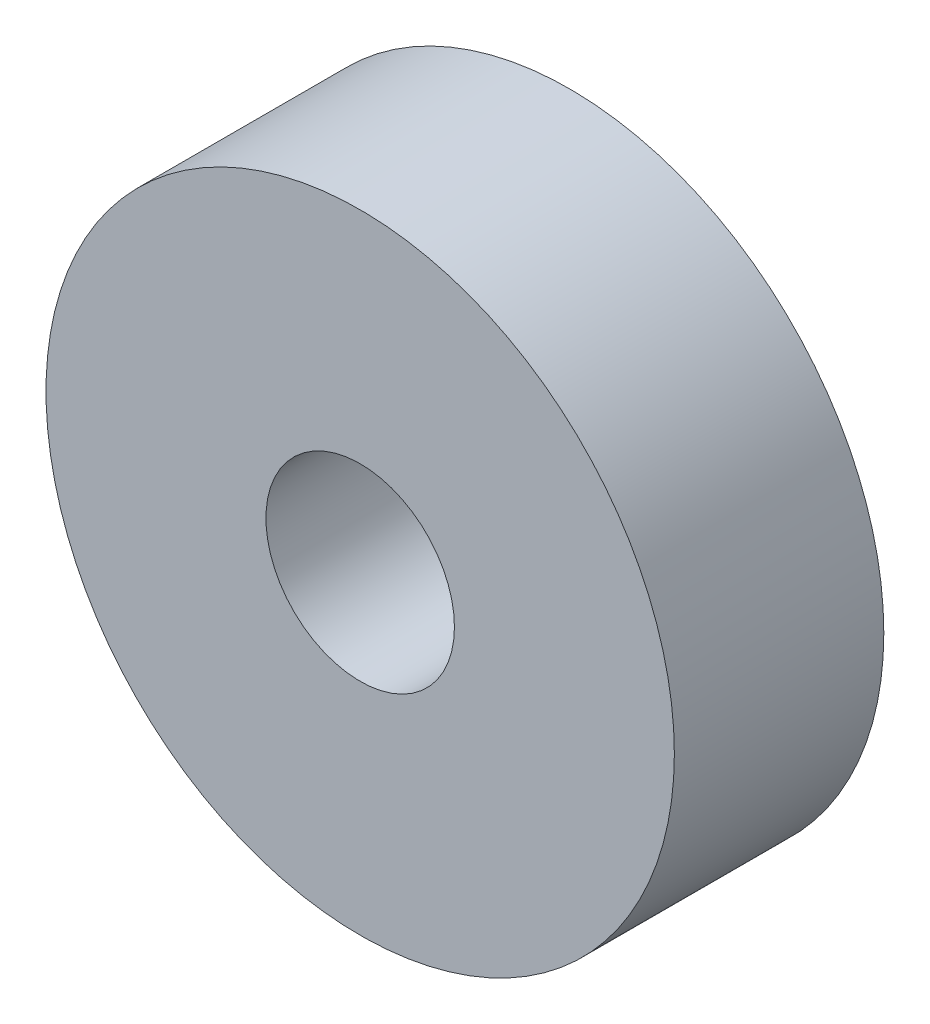
ISO-10303-21;
HEADER;
FILE_DESCRIPTION(('STEP AP214'),'2;1');
FILE_NAME('part.step','',(''),(''),'','','');
FILE_SCHEMA(('AUTOMOTIVE_DESIGN { 1 0 10303 214 1 1 1 1 }'));
ENDSEC;
DATA;
#1=APPLICATION_CONTEXT('core data for automotive mechanical design processes');
#2=APPLICATION_PROTOCOL_DEFINITION('international standard','automotive_design',2000,#1);
#3=PRODUCT_CONTEXT('',#1,'mechanical');
#4=PRODUCT('Part','Part','',(#3));
#5=PRODUCT_RELATED_PRODUCT_CATEGORY('part','',(#4));
#6=PRODUCT_DEFINITION_FORMATION('','',#4);
#7=PRODUCT_DEFINITION_CONTEXT('part definition',#1,'design');
#8=PRODUCT_DEFINITION('design','',#6,#7);
#9=PRODUCT_DEFINITION_SHAPE('','',#8);
#10=(LENGTH_UNIT() NAMED_UNIT(*) SI_UNIT(.MILLI.,.METRE.));
#11=(NAMED_UNIT(*) PLANE_ANGLE_UNIT() SI_UNIT($,.RADIAN.));
#12=(NAMED_UNIT(*) SI_UNIT($,.STERADIAN.) SOLID_ANGLE_UNIT());
#13=UNCERTAINTY_MEASURE_WITH_UNIT(LENGTH_MEASURE(1.E-05),#10,'distance_accuracy_value','');
#14=(GEOMETRIC_REPRESENTATION_CONTEXT(3) GLOBAL_UNCERTAINTY_ASSIGNED_CONTEXT((#13)) GLOBAL_UNIT_ASSIGNED_CONTEXT((#10,
#11,#12)) REPRESENTATION_CONTEXT('',''));
#15=CARTESIAN_POINT('',(0.,0.,0.));
#16=DIRECTION('',(0.,0.,1.));
#17=DIRECTION('',(1.,0.,0.));
#18=AXIS2_PLACEMENT_3D('',#15,#16,#17);
#19=CARTESIAN_POINT('',(0.,0.,10.));
#20=DIRECTION('',(0.,0.,1.));
#21=DIRECTION('',(1.,0.,0.));
#22=AXIS2_PLACEMENT_3D('',#19,#20,#21);
#23=PLANE('',#22);
#24=CARTESIAN_POINT('',(0.,0.,10.));
#25=DIRECTION('',(0.,0.,1.));
#26=DIRECTION('',(1.,0.,0.));
#27=AXIS2_PLACEMENT_3D('',#24,#25,#26);
#28=CIRCLE('',#27,15.);
#29=CARTESIAN_POINT('',(15.,0.,10.));
#30=VERTEX_POINT('',#29);
#31=EDGE_CURVE('E10',#30,#30,#28,.T.);
#32=ORIENTED_EDGE('',*,*,#31,.T.);
#33=EDGE_LOOP('',(#32));
#34=FACE_BOUND('',#33,.T.);
#35=CARTESIAN_POINT('',(0.,0.,10.));
#36=DIRECTION('',(0.,0.,1.));
#37=DIRECTION('',(1.,0.,0.));
#38=AXIS2_PLACEMENT_3D('',#35,#36,#37);
#39=CIRCLE('',#38,4.5);
#40=CARTESIAN_POINT('',(4.5,0.,10.));
#41=VERTEX_POINT('',#40);
#42=EDGE_CURVE('E48',#41,#41,#39,.T.);
#43=ORIENTED_EDGE('',*,*,#42,.F.);
#44=EDGE_LOOP('',(#43));
#45=FACE_BOUND('',#44,.T.);
#46=ADVANCED_FACE('F37',(#34,#45),#23,.T.);
#47=CARTESIAN_POINT('',(0.,0.,0.));
#48=DIRECTION('',(0.,0.,1.));
#49=DIRECTION('',(1.,0.,0.));
#50=AXIS2_PLACEMENT_3D('',#47,#48,#49);
#51=PLANE('',#50);
#52=CARTESIAN_POINT('',(0.,0.,0.));
#53=DIRECTION('',(0.,0.,1.));
#54=DIRECTION('',(1.,0.,0.));
#55=AXIS2_PLACEMENT_3D('',#52,#53,#54);
#56=CIRCLE('',#55,15.);
#57=CARTESIAN_POINT('',(15.,0.,0.));
#58=VERTEX_POINT('',#57);
#59=EDGE_CURVE('E41',#58,#58,#56,.T.);
#60=ORIENTED_EDGE('',*,*,#59,.F.);
#61=EDGE_LOOP('',(#60));
#62=FACE_BOUND('',#61,.T.);
#63=CARTESIAN_POINT('',(0.,0.,0.));
#64=DIRECTION('',(0.,0.,1.));
#65=DIRECTION('',(1.,0.,0.));
#66=AXIS2_PLACEMENT_3D('',#63,#64,#65);
#67=CIRCLE('',#66,4.5);
#68=CARTESIAN_POINT('',(4.5,0.,0.));
#69=VERTEX_POINT('',#68);
#70=EDGE_CURVE('E50',#69,#69,#67,.T.);
#71=ORIENTED_EDGE('',*,*,#70,.T.);
#72=EDGE_LOOP('',(#71));
#73=FACE_BOUND('',#72,.T.);
#74=ADVANCED_FACE('F60',(#62,#73),#51,.F.);
#75=CARTESIAN_POINT('',(0.,0.,10.));
#76=DIRECTION('',(0.,0.,-1.));
#77=DIRECTION('',(-1.,0.,0.));
#78=AXIS2_PLACEMENT_3D('',#75,#76,#77);
#79=CYLINDRICAL_SURFACE('',#78,15.);
#80=ORIENTED_EDGE('',*,*,#31,.F.);
#81=EDGE_LOOP('',(#80));
#82=FACE_BOUND('',#81,.T.);
#83=ORIENTED_EDGE('',*,*,#59,.T.);
#84=EDGE_LOOP('',(#83));
#85=FACE_BOUND('',#84,.T.);
#86=ADVANCED_FACE('F39',(#82,#85),#79,.T.);
#87=CARTESIAN_POINT('',(0.,0.,10.));
#88=DIRECTION('',(0.,0.,-1.));
#89=DIRECTION('',(-1.,0.,0.));
#90=AXIS2_PLACEMENT_3D('',#87,#88,#89);
#91=CYLINDRICAL_SURFACE('',#90,4.5);
#92=ORIENTED_EDGE('',*,*,#42,.T.);
#93=EDGE_LOOP('',(#92));
#94=FACE_BOUND('',#93,.T.);
#95=ORIENTED_EDGE('',*,*,#70,.F.);
#96=EDGE_LOOP('',(#95));
#97=FACE_BOUND('',#96,.T.);
#98=ADVANCED_FACE('F56',(#94,#97),#91,.F.);
#99=CLOSED_SHELL('',(#46,#74,#86,#98));
#100=MANIFOLD_SOLID_BREP('B2',#99);
#101=ADVANCED_BREP_SHAPE_REPRESENTATION('',(#18,#100),#14);
#102=SHAPE_DEFINITION_REPRESENTATION(#9,#101);
ENDSEC;
END-ISO-10303-21;
